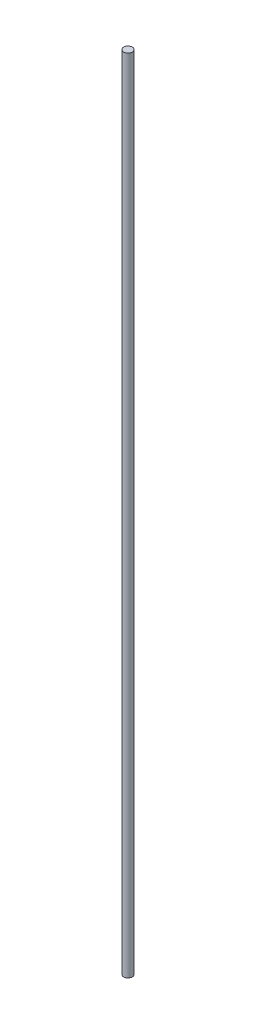
ISO-10303-21;
HEADER;
FILE_DESCRIPTION(('STEP AP214'),'2;1');
FILE_NAME('part.step','',(''),(''),'','','');
FILE_SCHEMA(('AUTOMOTIVE_DESIGN { 1 0 10303 214 1 1 1 1 }'));
ENDSEC;
DATA;
#1=APPLICATION_CONTEXT('core data for automotive mechanical design processes');
#2=APPLICATION_PROTOCOL_DEFINITION('international standard','automotive_design',2000,#1);
#3=PRODUCT_CONTEXT('',#1,'mechanical');
#4=PRODUCT('Part','Part','',(#3));
#5=PRODUCT_RELATED_PRODUCT_CATEGORY('part','',(#4));
#6=PRODUCT_DEFINITION_FORMATION('','',#4);
#7=PRODUCT_DEFINITION_CONTEXT('part definition',#1,'design');
#8=PRODUCT_DEFINITION('design','',#6,#7);
#9=PRODUCT_DEFINITION_SHAPE('','',#8);
#10=(LENGTH_UNIT() NAMED_UNIT(*) SI_UNIT(.MILLI.,.METRE.));
#11=(NAMED_UNIT(*) PLANE_ANGLE_UNIT() SI_UNIT($,.RADIAN.));
#12=(NAMED_UNIT(*) SI_UNIT($,.STERADIAN.) SOLID_ANGLE_UNIT());
#13=UNCERTAINTY_MEASURE_WITH_UNIT(LENGTH_MEASURE(1.E-05),#10,'distance_accuracy_value','');
#14=(GEOMETRIC_REPRESENTATION_CONTEXT(3) GLOBAL_UNCERTAINTY_ASSIGNED_CONTEXT((#13)) GLOBAL_UNIT_ASSIGNED_CONTEXT((#10,
#11,#12)) REPRESENTATION_CONTEXT('',''));
#15=CARTESIAN_POINT('',(0.,0.,0.));
#16=DIRECTION('',(0.,0.,1.));
#17=DIRECTION('',(1.,0.,0.));
#18=AXIS2_PLACEMENT_3D('',#15,#16,#17);
#19=CARTESIAN_POINT('',(0.,740.,0.));
#20=DIRECTION('',(0.,-1.,0.));
#21=DIRECTION('',(0.,0.,-1.));
#22=AXIS2_PLACEMENT_3D('',#19,#20,#21);
#23=CYLINDRICAL_SURFACE('',#22,4.);
#24=CARTESIAN_POINT('',(0.,740.,0.));
#25=DIRECTION('',(0.,1.,0.));
#26=DIRECTION('',(0.,0.,1.));
#27=AXIS2_PLACEMENT_3D('',#24,#25,#26);
#28=CIRCLE('',#27,4.);
#29=CARTESIAN_POINT('',(0.,740.,4.));
#30=VERTEX_POINT('',#29);
#31=EDGE_CURVE('E10',#30,#30,#28,.T.);
#32=ORIENTED_EDGE('',*,*,#31,.F.);
#33=EDGE_LOOP('',(#32));
#34=FACE_BOUND('',#33,.T.);
#35=CARTESIAN_POINT('',(0.,0.,0.));
#36=DIRECTION('',(0.,1.,0.));
#37=DIRECTION('',(0.,0.,1.));
#38=AXIS2_PLACEMENT_3D('',#35,#36,#37);
#39=CIRCLE('',#38,4.);
#40=CARTESIAN_POINT('',(0.,0.,4.));
#41=VERTEX_POINT('',#40);
#42=EDGE_CURVE('E34',#41,#41,#39,.T.);
#43=ORIENTED_EDGE('',*,*,#42,.T.);
#44=EDGE_LOOP('',(#43));
#45=FACE_BOUND('',#44,.T.);
#46=ADVANCED_FACE('F31',(#34,#45),#23,.T.);
#47=CARTESIAN_POINT('',(0.,740.,0.));
#48=DIRECTION('',(0.,1.,0.));
#49=DIRECTION('',(0.,0.,1.));
#50=AXIS2_PLACEMENT_3D('',#47,#48,#49);
#51=PLANE('',#50);
#52=ORIENTED_EDGE('',*,*,#31,.T.);
#53=EDGE_LOOP('',(#52));
#54=FACE_BOUND('',#53,.T.);
#55=ADVANCED_FACE('F46',(#54),#51,.T.);
#56=CARTESIAN_POINT('',(0.,0.,0.));
#57=DIRECTION('',(0.,1.,0.));
#58=DIRECTION('',(0.,0.,1.));
#59=AXIS2_PLACEMENT_3D('',#56,#57,#58);
#60=PLANE('',#59);
#61=ORIENTED_EDGE('',*,*,#42,.F.);
#62=EDGE_LOOP('',(#61));
#63=FACE_BOUND('',#62,.T.);
#64=ADVANCED_FACE('F44',(#63),#60,.F.);
#65=CLOSED_SHELL('',(#46,#55,#64));
#66=MANIFOLD_SOLID_BREP('B2',#65);
#67=ADVANCED_BREP_SHAPE_REPRESENTATION('',(#18,#66),#14);
#68=SHAPE_DEFINITION_REPRESENTATION(#9,#67);
ENDSEC;
END-ISO-10303-21;
